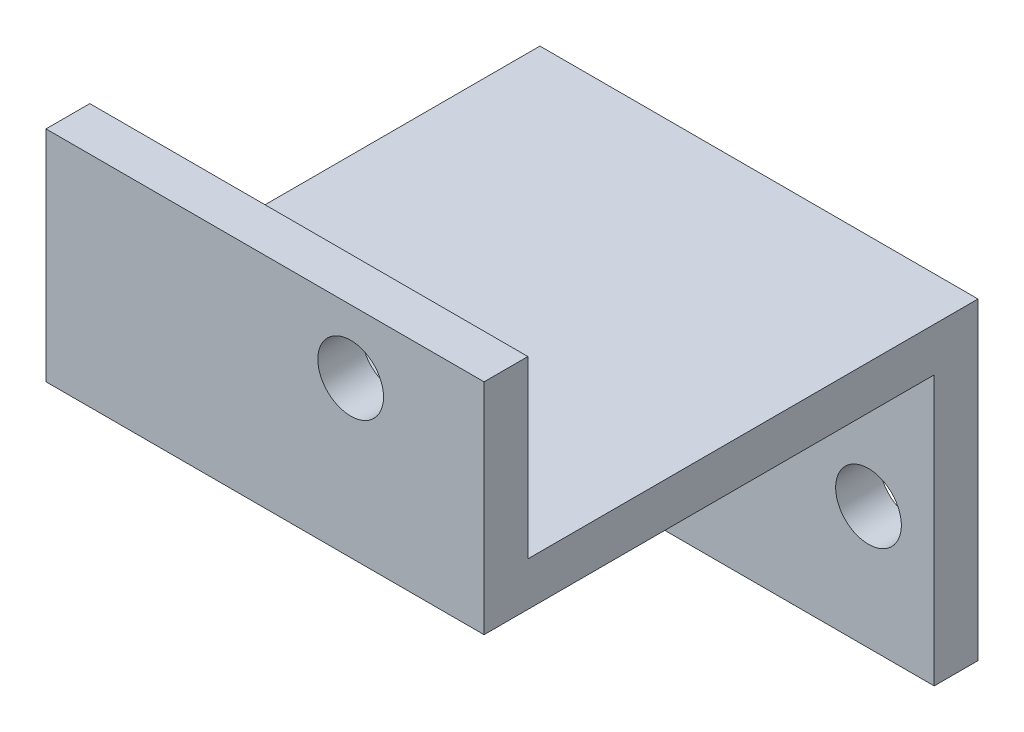
ISO-10303-21;
HEADER;
FILE_DESCRIPTION(('STEP AP214'),'2;1');
FILE_NAME('part.step','',(''),(''),'','','');
FILE_SCHEMA(('AUTOMOTIVE_DESIGN { 1 0 10303 214 1 1 1 1 }'));
ENDSEC;
DATA;
#1=APPLICATION_CONTEXT('core data for automotive mechanical design processes');
#2=APPLICATION_PROTOCOL_DEFINITION('international standard','automotive_design',2000,#1);
#3=PRODUCT_CONTEXT('',#1,'mechanical');
#4=PRODUCT('Part','Part','',(#3));
#5=PRODUCT_RELATED_PRODUCT_CATEGORY('part','',(#4));
#6=PRODUCT_DEFINITION_FORMATION('','',#4);
#7=PRODUCT_DEFINITION_CONTEXT('part definition',#1,'design');
#8=PRODUCT_DEFINITION('design','',#6,#7);
#9=PRODUCT_DEFINITION_SHAPE('','',#8);
#10=(LENGTH_UNIT() NAMED_UNIT(*) SI_UNIT(.MILLI.,.METRE.));
#11=(NAMED_UNIT(*) PLANE_ANGLE_UNIT() SI_UNIT($,.RADIAN.));
#12=(NAMED_UNIT(*) SI_UNIT($,.STERADIAN.) SOLID_ANGLE_UNIT());
#13=UNCERTAINTY_MEASURE_WITH_UNIT(LENGTH_MEASURE(1.E-05),#10,'distance_accuracy_value','');
#14=(GEOMETRIC_REPRESENTATION_CONTEXT(3) GLOBAL_UNCERTAINTY_ASSIGNED_CONTEXT((#13)) GLOBAL_UNIT_ASSIGNED_CONTEXT((#10,
#11,#12)) REPRESENTATION_CONTEXT('',''));
#15=CARTESIAN_POINT('',(0.,0.,0.));
#16=DIRECTION('',(0.,0.,1.));
#17=DIRECTION('',(1.,0.,0.));
#18=AXIS2_PLACEMENT_3D('',#15,#16,#17);
#19=CARTESIAN_POINT('',(0.,14.3,2.));
#20=DIRECTION('',(0.,-1.,0.));
#21=DIRECTION('',(0.,0.,-1.));
#22=AXIS2_PLACEMENT_3D('',#19,#20,#21);
#23=PLANE('',#22);
#24=DIRECTION('',(-1.,0.,0.));
#25=VECTOR('',#24,1.);
#26=CARTESIAN_POINT('',(20.,14.3,20.55));
#27=LINE('',#26,#25);
#28=CARTESIAN_POINT('',(20.,14.3,20.55));
#29=VERTEX_POINT('',#28);
#30=CARTESIAN_POINT('',(0.,14.3,20.55));
#31=VERTEX_POINT('',#30);
#32=EDGE_CURVE('E51',#29,#31,#27,.T.);
#33=ORIENTED_EDGE('',*,*,#32,.F.);
#34=DIRECTION('',(0.,0.,-1.));
#35=VECTOR('',#34,1.);
#36=CARTESIAN_POINT('',(20.,14.3,2.));
#37=LINE('',#36,#35);
#38=CARTESIAN_POINT('',(20.,14.3,0.));
#39=VERTEX_POINT('',#38);
#40=EDGE_CURVE('E124',#29,#39,#37,.T.);
#41=ORIENTED_EDGE('',*,*,#40,.T.);
#42=DIRECTION('',(-1.,0.,0.));
#43=VECTOR('',#42,1.);
#44=CARTESIAN_POINT('',(0.,14.3,0.));
#45=LINE('',#44,#43);
#46=CARTESIAN_POINT('',(0.,14.3,0.));
#47=VERTEX_POINT('',#46);
#48=EDGE_CURVE('E147',#39,#47,#45,.T.);
#49=ORIENTED_EDGE('',*,*,#48,.T.);
#50=DIRECTION('',(0.,0.,-1.));
#51=VECTOR('',#50,1.);
#52=CARTESIAN_POINT('',(0.,14.3,2.));
#53=LINE('',#52,#51);
#54=EDGE_CURVE('E151',#31,#47,#53,.T.);
#55=ORIENTED_EDGE('',*,*,#54,.F.);
#56=EDGE_LOOP('',(#33,#41,#49,#55));
#57=FACE_BOUND('',#56,.T.);
#58=ADVANCED_FACE('F35',(#57),#23,.F.);
#59=CARTESIAN_POINT('',(0.,0.,2.));
#60=DIRECTION('',(0.,0.,-1.));
#61=DIRECTION('',(-1.,0.,0.));
#62=AXIS2_PLACEMENT_3D('',#59,#60,#61);
#63=PLANE('',#62);
#64=CARTESIAN_POINT('',(3.,5.6,2.));
#65=DIRECTION('',(0.,0.,-1.));
#66=DIRECTION('',(-1.,0.,0.));
#67=AXIS2_PLACEMENT_3D('',#64,#65,#66);
#68=CIRCLE('',#67,1.5);
#69=CARTESIAN_POINT('',(1.5,5.6,2.));
#70=VERTEX_POINT('',#69);
#71=EDGE_CURVE('E183',#70,#70,#68,.T.);
#72=ORIENTED_EDGE('',*,*,#71,.T.);
#73=EDGE_LOOP('',(#72));
#74=FACE_BOUND('',#73,.T.);
#75=CARTESIAN_POINT('',(17.,5.6,2.));
#76=DIRECTION('',(0.,0.,-1.));
#77=DIRECTION('',(-1.,0.,0.));
#78=AXIS2_PLACEMENT_3D('',#75,#76,#77);
#79=CIRCLE('',#78,1.5);
#80=CARTESIAN_POINT('',(15.5,5.6,2.));
#81=VERTEX_POINT('',#80);
#82=EDGE_CURVE('E173',#81,#81,#79,.T.);
#83=ORIENTED_EDGE('',*,*,#82,.T.);
#84=EDGE_LOOP('',(#83));
#85=FACE_BOUND('',#84,.T.);
#86=DIRECTION('',(1.,0.,0.));
#87=VECTOR('',#86,1.);
#88=CARTESIAN_POINT('',(0.,12.3,2.));
#89=LINE('',#88,#87);
#90=CARTESIAN_POINT('',(0.,12.3,2.));
#91=VERTEX_POINT('',#90);
#92=CARTESIAN_POINT('',(20.,12.3,2.));
#93=VERTEX_POINT('',#92);
#94=EDGE_CURVE('E59',#91,#93,#89,.T.);
#95=ORIENTED_EDGE('',*,*,#94,.F.);
#96=DIRECTION('',(0.,-1.,0.));
#97=VECTOR('',#96,1.);
#98=CARTESIAN_POINT('',(0.,0.,2.));
#99=LINE('',#98,#97);
#100=CARTESIAN_POINT('',(0.,0.,2.));
#101=VERTEX_POINT('',#100);
#102=EDGE_CURVE('E144',#91,#101,#99,.T.);
#103=ORIENTED_EDGE('',*,*,#102,.T.);
#104=DIRECTION('',(1.,0.,0.));
#105=VECTOR('',#104,1.);
#106=CARTESIAN_POINT('',(0.,0.,2.));
#107=LINE('',#106,#105);
#108=CARTESIAN_POINT('',(20.,0.,2.));
#109=VERTEX_POINT('',#108);
#110=EDGE_CURVE('E146',#101,#109,#107,.T.);
#111=ORIENTED_EDGE('',*,*,#110,.T.);
#112=DIRECTION('',(0.,1.,0.));
#113=VECTOR('',#112,1.);
#114=CARTESIAN_POINT('',(20.,0.,2.));
#115=LINE('',#114,#113);
#116=EDGE_CURVE('E149',#109,#93,#115,.T.);
#117=ORIENTED_EDGE('',*,*,#116,.T.);
#118=EDGE_LOOP('',(#95,#103,#111,#117));
#119=FACE_BOUND('',#118,.T.);
#120=ADVANCED_FACE('F208',(#74,#85,#119),#63,.F.);
#121=CARTESIAN_POINT('',(0.,0.,2.));
#122=DIRECTION('',(1.,0.,0.));
#123=DIRECTION('',(0.,0.,-1.));
#124=AXIS2_PLACEMENT_3D('',#121,#122,#123);
#125=PLANE('',#124);
#126=DIRECTION('',(0.,-1.,0.));
#127=VECTOR('',#126,1.);
#128=CARTESIAN_POINT('',(0.,0.,0.));
#129=LINE('',#128,#127);
#130=CARTESIAN_POINT('',(0.,0.,0.));
#131=VERTEX_POINT('',#130);
#132=EDGE_CURVE('E143',#47,#131,#129,.T.);
#133=ORIENTED_EDGE('',*,*,#132,.T.);
#134=DIRECTION('',(0.,0.,-1.));
#135=VECTOR('',#134,1.);
#136=CARTESIAN_POINT('',(0.,0.,2.));
#137=LINE('',#136,#135);
#138=EDGE_CURVE('E11',#101,#131,#137,.T.);
#139=ORIENTED_EDGE('',*,*,#138,.F.);
#140=ORIENTED_EDGE('',*,*,#102,.F.);
#141=DIRECTION('',(0.,0.,-1.));
#142=VECTOR('',#141,1.);
#143=CARTESIAN_POINT('',(0.,12.3,22.55));
#144=LINE('',#143,#142);
#145=CARTESIAN_POINT('',(0.,12.3,22.55));
#146=VERTEX_POINT('',#145);
#147=EDGE_CURVE('E140',#146,#91,#144,.T.);
#148=ORIENTED_EDGE('',*,*,#147,.F.);
#149=DIRECTION('',(0.,-1.,0.));
#150=VECTOR('',#149,1.);
#151=CARTESIAN_POINT('',(0.,14.3,22.55));
#152=LINE('',#151,#150);
#153=CARTESIAN_POINT('',(0.,22.3,22.55));
#154=VERTEX_POINT('',#153);
#155=EDGE_CURVE('E126',#154,#146,#152,.T.);
#156=ORIENTED_EDGE('',*,*,#155,.F.);
#157=DIRECTION('',(0.,0.,1.));
#158=VECTOR('',#157,1.);
#159=CARTESIAN_POINT('',(0.,22.3,22.55));
#160=LINE('',#159,#158);
#161=CARTESIAN_POINT('',(0.,22.3,20.55));
#162=VERTEX_POINT('',#161);
#163=EDGE_CURVE('E111',#162,#154,#160,.T.);
#164=ORIENTED_EDGE('',*,*,#163,.F.);
#165=DIRECTION('',(0.,-1.,0.));
#166=VECTOR('',#165,1.);
#167=CARTESIAN_POINT('',(0.,22.3,20.55));
#168=LINE('',#167,#166);
#169=EDGE_CURVE('E107',#162,#31,#168,.T.);
#170=ORIENTED_EDGE('',*,*,#169,.T.);
#171=ORIENTED_EDGE('',*,*,#54,.T.);
#172=EDGE_LOOP('',(#133,#139,#140,#148,#156,#164,#170,#171));
#173=FACE_BOUND('',#172,.T.);
#174=ADVANCED_FACE('F37',(#173),#125,.F.);
#175=CARTESIAN_POINT('',(0.,0.,2.));
#176=DIRECTION('',(0.,1.,0.));
#177=DIRECTION('',(0.,0.,1.));
#178=AXIS2_PLACEMENT_3D('',#175,#176,#177);
#179=PLANE('',#178);
#180=DIRECTION('',(1.,0.,0.));
#181=VECTOR('',#180,1.);
#182=CARTESIAN_POINT('',(0.,0.,0.));
#183=LINE('',#182,#181);
#184=CARTESIAN_POINT('',(20.,0.,0.));
#185=VERTEX_POINT('',#184);
#186=EDGE_CURVE('E154',#131,#185,#183,.T.);
#187=ORIENTED_EDGE('',*,*,#186,.T.);
#188=DIRECTION('',(0.,0.,-1.));
#189=VECTOR('',#188,1.);
#190=CARTESIAN_POINT('',(20.,0.,2.));
#191=LINE('',#190,#189);
#192=EDGE_CURVE('E44',#109,#185,#191,.T.);
#193=ORIENTED_EDGE('',*,*,#192,.F.);
#194=ORIENTED_EDGE('',*,*,#110,.F.);
#195=ORIENTED_EDGE('',*,*,#138,.T.);
#196=EDGE_LOOP('',(#187,#193,#194,#195));
#197=FACE_BOUND('',#196,.T.);
#198=ADVANCED_FACE('F218',(#197),#179,.F.);
#199=CARTESIAN_POINT('',(20.,0.,2.));
#200=DIRECTION('',(-1.,0.,0.));
#201=DIRECTION('',(0.,0.,1.));
#202=AXIS2_PLACEMENT_3D('',#199,#200,#201);
#203=PLANE('',#202);
#204=DIRECTION('',(0.,1.,0.));
#205=VECTOR('',#204,1.);
#206=CARTESIAN_POINT('',(20.,0.,0.));
#207=LINE('',#206,#205);
#208=EDGE_CURVE('E156',#185,#39,#207,.T.);
#209=ORIENTED_EDGE('',*,*,#208,.T.);
#210=ORIENTED_EDGE('',*,*,#40,.F.);
#211=DIRECTION('',(0.,-1.,0.));
#212=VECTOR('',#211,1.);
#213=CARTESIAN_POINT('',(20.,22.3,20.55));
#214=LINE('',#213,#212);
#215=CARTESIAN_POINT('',(20.,22.3,20.55));
#216=VERTEX_POINT('',#215);
#217=EDGE_CURVE('E105',#216,#29,#214,.T.);
#218=ORIENTED_EDGE('',*,*,#217,.F.);
#219=DIRECTION('',(0.,0.,-1.));
#220=VECTOR('',#219,1.);
#221=CARTESIAN_POINT('',(20.,22.3,22.55));
#222=LINE('',#221,#220);
#223=CARTESIAN_POINT('',(20.,22.3,22.55));
#224=VERTEX_POINT('',#223);
#225=EDGE_CURVE('E112',#224,#216,#222,.T.);
#226=ORIENTED_EDGE('',*,*,#225,.F.);
#227=DIRECTION('',(0.,1.,0.));
#228=VECTOR('',#227,1.);
#229=CARTESIAN_POINT('',(20.,14.3,22.55));
#230=LINE('',#229,#228);
#231=CARTESIAN_POINT('',(20.,12.3,22.55));
#232=VERTEX_POINT('',#231);
#233=EDGE_CURVE('E135',#232,#224,#230,.T.);
#234=ORIENTED_EDGE('',*,*,#233,.F.);
#235=DIRECTION('',(0.,0.,-1.));
#236=VECTOR('',#235,1.);
#237=CARTESIAN_POINT('',(20.,12.3,22.55));
#238=LINE('',#237,#236);
#239=EDGE_CURVE('E136',#232,#93,#238,.T.);
#240=ORIENTED_EDGE('',*,*,#239,.T.);
#241=ORIENTED_EDGE('',*,*,#116,.F.);
#242=ORIENTED_EDGE('',*,*,#192,.T.);
#243=EDGE_LOOP('',(#209,#210,#218,#226,#234,#240,#241,#242));
#244=FACE_BOUND('',#243,.T.);
#245=ADVANCED_FACE('F123',(#244),#203,.F.);
#246=CARTESIAN_POINT('',(0.,0.,0.));
#247=DIRECTION('',(0.,0.,-1.));
#248=DIRECTION('',(-1.,0.,0.));
#249=AXIS2_PLACEMENT_3D('',#246,#247,#248);
#250=PLANE('',#249);
#251=CARTESIAN_POINT('',(3.,5.6,0.));
#252=DIRECTION('',(0.,0.,-1.));
#253=DIRECTION('',(-1.,0.,0.));
#254=AXIS2_PLACEMENT_3D('',#251,#252,#253);
#255=CIRCLE('',#254,1.5);
#256=CARTESIAN_POINT('',(1.5,5.6,0.));
#257=VERTEX_POINT('',#256);
#258=EDGE_CURVE('E186',#257,#257,#255,.T.);
#259=ORIENTED_EDGE('',*,*,#258,.F.);
#260=EDGE_LOOP('',(#259));
#261=FACE_BOUND('',#260,.T.);
#262=CARTESIAN_POINT('',(17.,5.6,0.));
#263=DIRECTION('',(0.,0.,-1.));
#264=DIRECTION('',(-1.,0.,0.));
#265=AXIS2_PLACEMENT_3D('',#262,#263,#264);
#266=CIRCLE('',#265,1.5);
#267=CARTESIAN_POINT('',(15.5,5.6,0.));
#268=VERTEX_POINT('',#267);
#269=EDGE_CURVE('E180',#268,#268,#266,.T.);
#270=ORIENTED_EDGE('',*,*,#269,.F.);
#271=EDGE_LOOP('',(#270));
#272=FACE_BOUND('',#271,.T.);
#273=ORIENTED_EDGE('',*,*,#132,.F.);
#274=ORIENTED_EDGE('',*,*,#48,.F.);
#275=ORIENTED_EDGE('',*,*,#208,.F.);
#276=ORIENTED_EDGE('',*,*,#186,.F.);
#277=EDGE_LOOP('',(#273,#274,#275,#276));
#278=FACE_BOUND('',#277,.T.);
#279=ADVANCED_FACE('F171',(#261,#272,#278),#250,.T.);
#280=CARTESIAN_POINT('',(0.,12.3,22.55));
#281=DIRECTION('',(0.,1.,0.));
#282=DIRECTION('',(0.,0.,1.));
#283=AXIS2_PLACEMENT_3D('',#280,#281,#282);
#284=PLANE('',#283);
#285=ORIENTED_EDGE('',*,*,#94,.T.);
#286=ORIENTED_EDGE('',*,*,#239,.F.);
#287=DIRECTION('',(1.,0.,0.));
#288=VECTOR('',#287,1.);
#289=CARTESIAN_POINT('',(0.,12.3,22.55));
#290=LINE('',#289,#288);
#291=EDGE_CURVE('E133',#146,#232,#290,.T.);
#292=ORIENTED_EDGE('',*,*,#291,.F.);
#293=ORIENTED_EDGE('',*,*,#147,.T.);
#294=EDGE_LOOP('',(#285,#286,#292,#293));
#295=FACE_BOUND('',#294,.T.);
#296=ADVANCED_FACE('F225',(#295),#284,.F.);
#297=CARTESIAN_POINT('',(0.,0.,22.55));
#298=DIRECTION('',(0.,0.,1.));
#299=DIRECTION('',(1.,0.,0.));
#300=AXIS2_PLACEMENT_3D('',#297,#298,#299);
#301=PLANE('',#300);
#302=CARTESIAN_POINT('',(13.91,19.4,22.55));
#303=DIRECTION('',(0.,0.,1.));
#304=DIRECTION('',(1.,0.,0.));
#305=AXIS2_PLACEMENT_3D('',#302,#303,#304);
#306=CIRCLE('',#305,1.5);
#307=CARTESIAN_POINT('',(15.41,19.4,22.55));
#308=VERTEX_POINT('',#307);
#309=EDGE_CURVE('E189',#308,#308,#306,.T.);
#310=ORIENTED_EDGE('',*,*,#309,.F.);
#311=EDGE_LOOP('',(#310));
#312=FACE_BOUND('',#311,.T.);
#313=ORIENTED_EDGE('',*,*,#155,.T.);
#314=ORIENTED_EDGE('',*,*,#291,.T.);
#315=ORIENTED_EDGE('',*,*,#233,.T.);
#316=DIRECTION('',(1.,0.,0.));
#317=VECTOR('',#316,1.);
#318=CARTESIAN_POINT('',(20.,22.3,22.55));
#319=LINE('',#318,#317);
#320=EDGE_CURVE('E118',#154,#224,#319,.T.);
#321=ORIENTED_EDGE('',*,*,#320,.F.);
#322=EDGE_LOOP('',(#313,#314,#315,#321));
#323=FACE_BOUND('',#322,.T.);
#324=ADVANCED_FACE('F228',(#312,#323),#301,.T.);
#325=CARTESIAN_POINT('',(20.,22.3,20.55));
#326=DIRECTION('',(0.,0.,1.));
#327=DIRECTION('',(1.,0.,0.));
#328=AXIS2_PLACEMENT_3D('',#325,#326,#327);
#329=PLANE('',#328);
#330=CARTESIAN_POINT('',(13.91,19.4,20.55));
#331=DIRECTION('',(0.,0.,1.));
#332=DIRECTION('',(1.,0.,0.));
#333=AXIS2_PLACEMENT_3D('',#330,#331,#332);
#334=CIRCLE('',#333,1.5);
#335=CARTESIAN_POINT('',(15.41,19.4,20.55));
#336=VERTEX_POINT('',#335);
#337=EDGE_CURVE('E39',#336,#336,#334,.T.);
#338=ORIENTED_EDGE('',*,*,#337,.T.);
#339=EDGE_LOOP('',(#338));
#340=FACE_BOUND('',#339,.T.);
#341=ORIENTED_EDGE('',*,*,#32,.T.);
#342=ORIENTED_EDGE('',*,*,#169,.F.);
#343=DIRECTION('',(-1.,0.,0.));
#344=VECTOR('',#343,1.);
#345=CARTESIAN_POINT('',(20.,22.3,20.55));
#346=LINE('',#345,#344);
#347=EDGE_CURVE('E101',#216,#162,#346,.T.);
#348=ORIENTED_EDGE('',*,*,#347,.F.);
#349=ORIENTED_EDGE('',*,*,#217,.T.);
#350=EDGE_LOOP('',(#341,#342,#348,#349));
#351=FACE_BOUND('',#350,.T.);
#352=ADVANCED_FACE('F103',(#340,#351),#329,.F.);
#353=CARTESIAN_POINT('',(0.,22.3,0.));
#354=DIRECTION('',(0.,1.,0.));
#355=DIRECTION('',(0.,0.,1.));
#356=AXIS2_PLACEMENT_3D('',#353,#354,#355);
#357=PLANE('',#356);
#358=ORIENTED_EDGE('',*,*,#225,.T.);
#359=ORIENTED_EDGE('',*,*,#347,.T.);
#360=ORIENTED_EDGE('',*,*,#163,.T.);
#361=ORIENTED_EDGE('',*,*,#320,.T.);
#362=EDGE_LOOP('',(#358,#359,#360,#361));
#363=FACE_BOUND('',#362,.T.);
#364=ADVANCED_FACE('F116',(#363),#357,.T.);
#365=CARTESIAN_POINT('',(17.,5.6,8.));
#366=DIRECTION('',(0.,0.,-1.));
#367=DIRECTION('',(-1.,0.,0.));
#368=AXIS2_PLACEMENT_3D('',#365,#366,#367);
#369=CYLINDRICAL_SURFACE('',#368,1.5);
#370=ORIENTED_EDGE('',*,*,#269,.T.);
#371=EDGE_LOOP('',(#370));
#372=FACE_BOUND('',#371,.T.);
#373=ORIENTED_EDGE('',*,*,#82,.F.);
#374=EDGE_LOOP('',(#373));
#375=FACE_BOUND('',#374,.T.);
#376=ADVANCED_FACE('F204',(#372,#375),#369,.F.);
#377=CARTESIAN_POINT('',(3.,5.6,8.));
#378=DIRECTION('',(0.,0.,-1.));
#379=DIRECTION('',(-1.,0.,0.));
#380=AXIS2_PLACEMENT_3D('',#377,#378,#379);
#381=CYLINDRICAL_SURFACE('',#380,1.5);
#382=ORIENTED_EDGE('',*,*,#258,.T.);
#383=EDGE_LOOP('',(#382));
#384=FACE_BOUND('',#383,.T.);
#385=ORIENTED_EDGE('',*,*,#71,.F.);
#386=EDGE_LOOP('',(#385));
#387=FACE_BOUND('',#386,.T.);
#388=ADVANCED_FACE('F199',(#384,#387),#381,.F.);
#389=CARTESIAN_POINT('',(13.91,19.4,14.55));
#390=DIRECTION('',(0.,0.,1.));
#391=DIRECTION('',(1.,0.,0.));
#392=AXIS2_PLACEMENT_3D('',#389,#390,#391);
#393=CYLINDRICAL_SURFACE('',#392,1.5);
#394=ORIENTED_EDGE('',*,*,#309,.T.);
#395=EDGE_LOOP('',(#394));
#396=FACE_BOUND('',#395,.T.);
#397=ORIENTED_EDGE('',*,*,#337,.F.);
#398=EDGE_LOOP('',(#397));
#399=FACE_BOUND('',#398,.T.);
#400=ADVANCED_FACE('F197',(#396,#399),#393,.F.);
#401=CLOSED_SHELL('',(#58,#120,#174,#198,#245,#279,#296,#324,#352,#364,#376,#388,#400));
#402=MANIFOLD_SOLID_BREP('B2',#401);
#403=ADVANCED_BREP_SHAPE_REPRESENTATION('',(#18,#402),#14);
#404=SHAPE_DEFINITION_REPRESENTATION(#9,#403);
ENDSEC;
END-ISO-10303-21;
